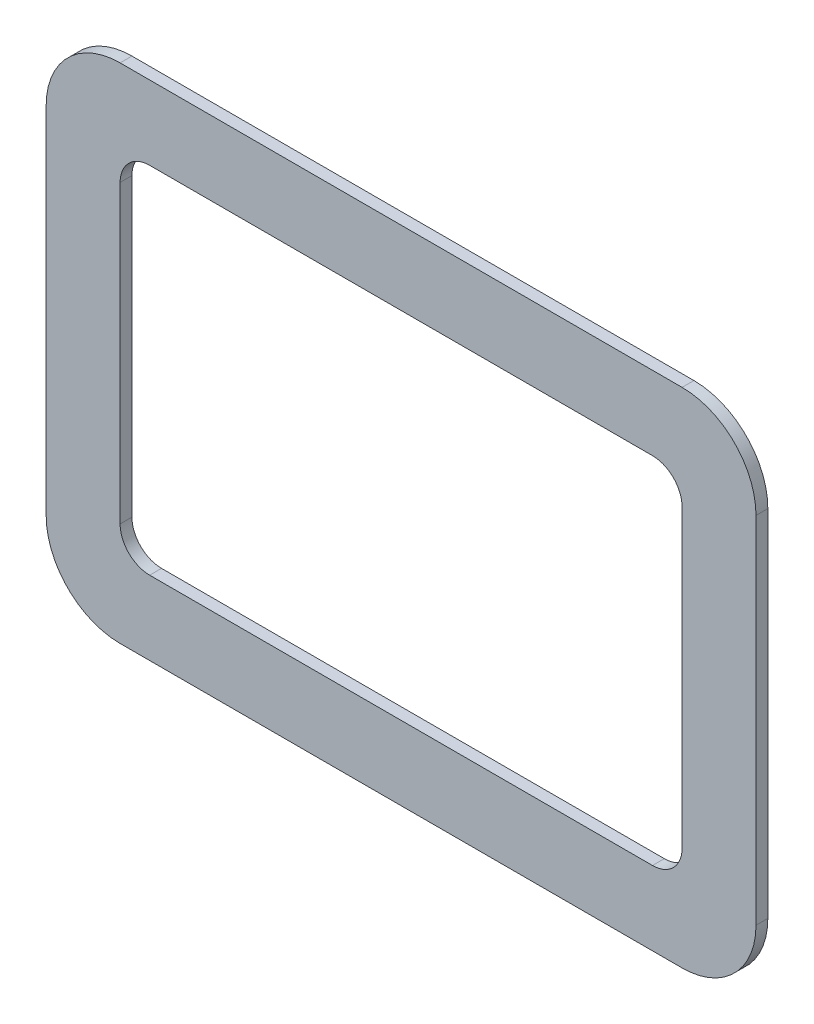
ISO-10303-21;
HEADER;
FILE_DESCRIPTION(('STEP AP214'),'2;1');
FILE_NAME('part.step','',(''),(''),'','','');
FILE_SCHEMA(('AUTOMOTIVE_DESIGN { 1 0 10303 214 1 1 1 1 }'));
ENDSEC;
DATA;
#1=APPLICATION_CONTEXT('core data for automotive mechanical design processes');
#2=APPLICATION_PROTOCOL_DEFINITION('international standard','automotive_design',2000,#1);
#3=PRODUCT_CONTEXT('',#1,'mechanical');
#4=PRODUCT('Part','Part','',(#3));
#5=PRODUCT_RELATED_PRODUCT_CATEGORY('part','',(#4));
#6=PRODUCT_DEFINITION_FORMATION('','',#4);
#7=PRODUCT_DEFINITION_CONTEXT('part definition',#1,'design');
#8=PRODUCT_DEFINITION('design','',#6,#7);
#9=PRODUCT_DEFINITION_SHAPE('','',#8);
#10=(LENGTH_UNIT() NAMED_UNIT(*) SI_UNIT(.MILLI.,.METRE.));
#11=(NAMED_UNIT(*) PLANE_ANGLE_UNIT() SI_UNIT($,.RADIAN.));
#12=(NAMED_UNIT(*) SI_UNIT($,.STERADIAN.) SOLID_ANGLE_UNIT());
#13=UNCERTAINTY_MEASURE_WITH_UNIT(LENGTH_MEASURE(1.E-05),#10,'distance_accuracy_value','');
#14=(GEOMETRIC_REPRESENTATION_CONTEXT(3) GLOBAL_UNCERTAINTY_ASSIGNED_CONTEXT((#13)) GLOBAL_UNIT_ASSIGNED_CONTEXT((#10,
#11,#12)) REPRESENTATION_CONTEXT('',''));
#15=CARTESIAN_POINT('',(0.,0.,0.));
#16=DIRECTION('',(0.,0.,1.));
#17=DIRECTION('',(1.,0.,0.));
#18=AXIS2_PLACEMENT_3D('',#15,#16,#17);
#19=CARTESIAN_POINT('',(-19.,-12.,0.8));
#20=DIRECTION('',(0.,0.,1.));
#21=DIRECTION('',(1.,0.,0.));
#22=AXIS2_PLACEMENT_3D('',#19,#20,#21);
#23=PLANE('',#22);
#24=CARTESIAN_POINT('',(-19.,-12.,0.8));
#25=DIRECTION('',(0.,0.,1.));
#26=DIRECTION('',(1.,0.,0.));
#27=AXIS2_PLACEMENT_3D('',#24,#25,#26);
#28=CIRCLE('',#27,5.);
#29=CARTESIAN_POINT('',(-24.,-12.,0.8));
#30=VERTEX_POINT('',#29);
#31=CARTESIAN_POINT('',(-19.,-17.,0.8));
#32=VERTEX_POINT('',#31);
#33=EDGE_CURVE('E214',#30,#32,#28,.T.);
#34=ORIENTED_EDGE('',*,*,#33,.T.);
#35=DIRECTION('',(1.,0.,0.));
#36=VECTOR('',#35,1.);
#37=CARTESIAN_POINT('',(-19.,-17.,0.8));
#38=LINE('',#37,#36);
#39=CARTESIAN_POINT('',(19.,-17.,0.8));
#40=VERTEX_POINT('',#39);
#41=EDGE_CURVE('E217',#32,#40,#38,.T.);
#42=ORIENTED_EDGE('',*,*,#41,.T.);
#43=CARTESIAN_POINT('',(19.,-12.,0.8));
#44=DIRECTION('',(0.,0.,1.));
#45=DIRECTION('',(1.,0.,0.));
#46=AXIS2_PLACEMENT_3D('',#43,#44,#45);
#47=CIRCLE('',#46,5.);
#48=CARTESIAN_POINT('',(24.,-12.,0.8));
#49=VERTEX_POINT('',#48);
#50=EDGE_CURVE('E220',#40,#49,#47,.T.);
#51=ORIENTED_EDGE('',*,*,#50,.T.);
#52=DIRECTION('',(0.,1.,0.));
#53=VECTOR('',#52,1.);
#54=CARTESIAN_POINT('',(24.,12.,0.8));
#55=LINE('',#54,#53);
#56=CARTESIAN_POINT('',(24.,12.,0.8));
#57=VERTEX_POINT('',#56);
#58=EDGE_CURVE('E222',#49,#57,#55,.T.);
#59=ORIENTED_EDGE('',*,*,#58,.T.);
#60=CARTESIAN_POINT('',(19.,12.,0.8));
#61=DIRECTION('',(0.,0.,1.));
#62=DIRECTION('',(-1.,0.,0.));
#63=AXIS2_PLACEMENT_3D('',#60,#61,#62);
#64=CIRCLE('',#63,5.);
#65=CARTESIAN_POINT('',(19.,17.,0.8));
#66=VERTEX_POINT('',#65);
#67=EDGE_CURVE('E224',#57,#66,#64,.T.);
#68=ORIENTED_EDGE('',*,*,#67,.T.);
#69=DIRECTION('',(-1.,0.,0.));
#70=VECTOR('',#69,1.);
#71=CARTESIAN_POINT('',(-19.,17.,0.8));
#72=LINE('',#71,#70);
#73=CARTESIAN_POINT('',(-19.,17.,0.8));
#74=VERTEX_POINT('',#73);
#75=EDGE_CURVE('E226',#66,#74,#72,.T.);
#76=ORIENTED_EDGE('',*,*,#75,.T.);
#77=CARTESIAN_POINT('',(-19.,12.,0.8));
#78=DIRECTION('',(0.,0.,1.));
#79=DIRECTION('',(1.,0.,0.));
#80=AXIS2_PLACEMENT_3D('',#77,#78,#79);
#81=CIRCLE('',#80,5.);
#82=CARTESIAN_POINT('',(-24.,12.,0.8));
#83=VERTEX_POINT('',#82);
#84=EDGE_CURVE('E228',#74,#83,#81,.T.);
#85=ORIENTED_EDGE('',*,*,#84,.T.);
#86=DIRECTION('',(0.,-1.,0.));
#87=VECTOR('',#86,1.);
#88=CARTESIAN_POINT('',(-24.,12.,0.8));
#89=LINE('',#88,#87);
#90=EDGE_CURVE('E230',#83,#30,#89,.T.);
#91=ORIENTED_EDGE('',*,*,#90,.T.);
#92=EDGE_LOOP('',(#34,#42,#51,#59,#68,#76,#85,#91));
#93=FACE_BOUND('',#92,.T.);
#94=DIRECTION('',(0.,-1.,0.));
#95=VECTOR('',#94,1.);
#96=CARTESIAN_POINT('',(-19.,9.99999999999999,0.8));
#97=LINE('',#96,#95);
#98=CARTESIAN_POINT('',(-19.,9.99999999999999,0.8));
#99=VERTEX_POINT('',#98);
#100=CARTESIAN_POINT('',(-19.,-10.,0.8));
#101=VERTEX_POINT('',#100);
#102=EDGE_CURVE('E157',#99,#101,#97,.T.);
#103=ORIENTED_EDGE('',*,*,#102,.F.);
#104=CARTESIAN_POINT('',(-17.,9.99999999999999,0.8));
#105=DIRECTION('',(0.,0.,1.));
#106=DIRECTION('',(1.,0.,0.));
#107=AXIS2_PLACEMENT_3D('',#104,#105,#106);
#108=CIRCLE('',#107,2.);
#109=CARTESIAN_POINT('',(-17.,12.,0.8));
#110=VERTEX_POINT('',#109);
#111=EDGE_CURVE('E149',#110,#99,#108,.T.);
#112=ORIENTED_EDGE('',*,*,#111,.F.);
#113=DIRECTION('',(-1.,0.,0.));
#114=VECTOR('',#113,1.);
#115=CARTESIAN_POINT('',(-17.,12.,0.8));
#116=LINE('',#115,#114);
#117=CARTESIAN_POINT('',(17.,12.,0.8));
#118=VERTEX_POINT('',#117);
#119=EDGE_CURVE('E182',#118,#110,#116,.T.);
#120=ORIENTED_EDGE('',*,*,#119,.F.);
#121=CARTESIAN_POINT('',(17.,9.99999999999999,0.8));
#122=DIRECTION('',(0.,0.,1.));
#123=DIRECTION('',(-1.,0.,0.));
#124=AXIS2_PLACEMENT_3D('',#121,#122,#123);
#125=CIRCLE('',#124,2.);
#126=CARTESIAN_POINT('',(19.,9.99999999999999,0.8));
#127=VERTEX_POINT('',#126);
#128=EDGE_CURVE('E180',#127,#118,#125,.T.);
#129=ORIENTED_EDGE('',*,*,#128,.F.);
#130=DIRECTION('',(0.,1.,0.));
#131=VECTOR('',#130,1.);
#132=CARTESIAN_POINT('',(19.,9.99999999999999,0.8));
#133=LINE('',#132,#131);
#134=CARTESIAN_POINT('',(19.,-10.,0.8));
#135=VERTEX_POINT('',#134);
#136=EDGE_CURVE('E178',#135,#127,#133,.T.);
#137=ORIENTED_EDGE('',*,*,#136,.F.);
#138=CARTESIAN_POINT('',(17.,-10.,0.8));
#139=DIRECTION('',(0.,0.,1.));
#140=DIRECTION('',(1.,0.,0.));
#141=AXIS2_PLACEMENT_3D('',#138,#139,#140);
#142=CIRCLE('',#141,2.);
#143=CARTESIAN_POINT('',(17.,-12.,0.8));
#144=VERTEX_POINT('',#143);
#145=EDGE_CURVE('E176',#144,#135,#142,.T.);
#146=ORIENTED_EDGE('',*,*,#145,.F.);
#147=DIRECTION('',(1.,0.,0.));
#148=VECTOR('',#147,1.);
#149=CARTESIAN_POINT('',(-17.,-12.,0.8));
#150=LINE('',#149,#148);
#151=CARTESIAN_POINT('',(-17.,-12.,0.8));
#152=VERTEX_POINT('',#151);
#153=EDGE_CURVE('E172',#152,#144,#150,.T.);
#154=ORIENTED_EDGE('',*,*,#153,.F.);
#155=CARTESIAN_POINT('',(-17.,-10.,0.8));
#156=DIRECTION('',(0.,0.,1.));
#157=DIRECTION('',(1.,0.,0.));
#158=AXIS2_PLACEMENT_3D('',#155,#156,#157);
#159=CIRCLE('',#158,2.);
#160=EDGE_CURVE('E170',#101,#152,#159,.T.);
#161=ORIENTED_EDGE('',*,*,#160,.F.);
#162=EDGE_LOOP('',(#103,#112,#120,#129,#137,#146,#154,#161));
#163=FACE_BOUND('',#162,.T.);
#164=ADVANCED_FACE('F36',(#93,#163),#23,.T.);
#165=CARTESIAN_POINT('',(-19.,-12.,0.));
#166=DIRECTION('',(0.,0.,1.));
#167=DIRECTION('',(1.,0.,0.));
#168=AXIS2_PLACEMENT_3D('',#165,#166,#167);
#169=PLANE('',#168);
#170=CARTESIAN_POINT('',(-19.,-12.,0.));
#171=DIRECTION('',(0.,0.,1.));
#172=DIRECTION('',(1.,0.,0.));
#173=AXIS2_PLACEMENT_3D('',#170,#171,#172);
#174=CIRCLE('',#173,5.);
#175=CARTESIAN_POINT('',(-24.,-12.,0.));
#176=VERTEX_POINT('',#175);
#177=CARTESIAN_POINT('',(-19.,-17.,0.));
#178=VERTEX_POINT('',#177);
#179=EDGE_CURVE('E165',#176,#178,#174,.T.);
#180=ORIENTED_EDGE('',*,*,#179,.F.);
#181=DIRECTION('',(0.,-1.,0.));
#182=VECTOR('',#181,1.);
#183=CARTESIAN_POINT('',(-24.,12.,0.));
#184=LINE('',#183,#182);
#185=CARTESIAN_POINT('',(-24.,12.,0.));
#186=VERTEX_POINT('',#185);
#187=EDGE_CURVE('E218',#186,#176,#184,.T.);
#188=ORIENTED_EDGE('',*,*,#187,.F.);
#189=CARTESIAN_POINT('',(-19.,12.,0.));
#190=DIRECTION('',(0.,0.,1.));
#191=DIRECTION('',(1.,0.,0.));
#192=AXIS2_PLACEMENT_3D('',#189,#190,#191);
#193=CIRCLE('',#192,5.);
#194=CARTESIAN_POINT('',(-19.,17.,0.));
#195=VERTEX_POINT('',#194);
#196=EDGE_CURVE('E245',#195,#186,#193,.T.);
#197=ORIENTED_EDGE('',*,*,#196,.F.);
#198=DIRECTION('',(-1.,0.,0.));
#199=VECTOR('',#198,1.);
#200=CARTESIAN_POINT('',(-19.,17.,0.));
#201=LINE('',#200,#199);
#202=CARTESIAN_POINT('',(19.,17.,0.));
#203=VERTEX_POINT('',#202);
#204=EDGE_CURVE('E243',#203,#195,#201,.T.);
#205=ORIENTED_EDGE('',*,*,#204,.F.);
#206=CARTESIAN_POINT('',(19.,12.,0.));
#207=DIRECTION('',(0.,0.,1.));
#208=DIRECTION('',(-1.,0.,0.));
#209=AXIS2_PLACEMENT_3D('',#206,#207,#208);
#210=CIRCLE('',#209,5.);
#211=CARTESIAN_POINT('',(24.,12.,0.));
#212=VERTEX_POINT('',#211);
#213=EDGE_CURVE('E241',#212,#203,#210,.T.);
#214=ORIENTED_EDGE('',*,*,#213,.F.);
#215=DIRECTION('',(0.,1.,0.));
#216=VECTOR('',#215,1.);
#217=CARTESIAN_POINT('',(24.,12.,0.));
#218=LINE('',#217,#216);
#219=CARTESIAN_POINT('',(24.,-12.,0.));
#220=VERTEX_POINT('',#219);
#221=EDGE_CURVE('E239',#220,#212,#218,.T.);
#222=ORIENTED_EDGE('',*,*,#221,.F.);
#223=CARTESIAN_POINT('',(19.,-12.,0.));
#224=DIRECTION('',(0.,0.,1.));
#225=DIRECTION('',(1.,0.,0.));
#226=AXIS2_PLACEMENT_3D('',#223,#224,#225);
#227=CIRCLE('',#226,5.);
#228=CARTESIAN_POINT('',(19.,-17.,0.));
#229=VERTEX_POINT('',#228);
#230=EDGE_CURVE('E237',#229,#220,#227,.T.);
#231=ORIENTED_EDGE('',*,*,#230,.F.);
#232=DIRECTION('',(1.,0.,0.));
#233=VECTOR('',#232,1.);
#234=CARTESIAN_POINT('',(-19.,-17.,0.));
#235=LINE('',#234,#233);
#236=EDGE_CURVE('E235',#178,#229,#235,.T.);
#237=ORIENTED_EDGE('',*,*,#236,.F.);
#238=EDGE_LOOP('',(#180,#188,#197,#205,#214,#222,#231,#237));
#239=FACE_BOUND('',#238,.T.);
#240=CARTESIAN_POINT('',(-17.,9.99999999999999,0.));
#241=DIRECTION('',(0.,0.,1.));
#242=DIRECTION('',(1.,0.,0.));
#243=AXIS2_PLACEMENT_3D('',#240,#241,#242);
#244=CIRCLE('',#243,2.);
#245=CARTESIAN_POINT('',(-17.,12.,0.));
#246=VERTEX_POINT('',#245);
#247=CARTESIAN_POINT('',(-19.,9.99999999999999,0.));
#248=VERTEX_POINT('',#247);
#249=EDGE_CURVE('E59',#246,#248,#244,.T.);
#250=ORIENTED_EDGE('',*,*,#249,.T.);
#251=DIRECTION('',(0.,-1.,0.));
#252=VECTOR('',#251,1.);
#253=CARTESIAN_POINT('',(-19.,9.99999999999999,0.));
#254=LINE('',#253,#252);
#255=CARTESIAN_POINT('',(-19.,-10.,0.));
#256=VERTEX_POINT('',#255);
#257=EDGE_CURVE('E164',#248,#256,#254,.T.);
#258=ORIENTED_EDGE('',*,*,#257,.T.);
#259=CARTESIAN_POINT('',(-17.,-10.,0.));
#260=DIRECTION('',(0.,0.,1.));
#261=DIRECTION('',(1.,0.,0.));
#262=AXIS2_PLACEMENT_3D('',#259,#260,#261);
#263=CIRCLE('',#262,2.);
#264=CARTESIAN_POINT('',(-17.,-12.,0.));
#265=VERTEX_POINT('',#264);
#266=EDGE_CURVE('E186',#256,#265,#263,.T.);
#267=ORIENTED_EDGE('',*,*,#266,.T.);
#268=DIRECTION('',(1.,0.,0.));
#269=VECTOR('',#268,1.);
#270=CARTESIAN_POINT('',(-17.,-12.,0.));
#271=LINE('',#270,#269);
#272=CARTESIAN_POINT('',(17.,-12.,0.));
#273=VERTEX_POINT('',#272);
#274=EDGE_CURVE('E189',#265,#273,#271,.T.);
#275=ORIENTED_EDGE('',*,*,#274,.T.);
#276=CARTESIAN_POINT('',(17.,-10.,0.));
#277=DIRECTION('',(0.,0.,1.));
#278=DIRECTION('',(1.,0.,0.));
#279=AXIS2_PLACEMENT_3D('',#276,#277,#278);
#280=CIRCLE('',#279,2.);
#281=CARTESIAN_POINT('',(19.,-10.,0.));
#282=VERTEX_POINT('',#281);
#283=EDGE_CURVE('E192',#273,#282,#280,.T.);
#284=ORIENTED_EDGE('',*,*,#283,.T.);
#285=DIRECTION('',(0.,1.,0.));
#286=VECTOR('',#285,1.);
#287=CARTESIAN_POINT('',(19.,9.99999999999999,0.));
#288=LINE('',#287,#286);
#289=CARTESIAN_POINT('',(19.,9.99999999999999,0.));
#290=VERTEX_POINT('',#289);
#291=EDGE_CURVE('E195',#282,#290,#288,.T.);
#292=ORIENTED_EDGE('',*,*,#291,.T.);
#293=CARTESIAN_POINT('',(17.,9.99999999999999,0.));
#294=DIRECTION('',(0.,0.,1.));
#295=DIRECTION('',(-1.,0.,0.));
#296=AXIS2_PLACEMENT_3D('',#293,#294,#295);
#297=CIRCLE('',#296,2.);
#298=CARTESIAN_POINT('',(17.,12.,0.));
#299=VERTEX_POINT('',#298);
#300=EDGE_CURVE('E198',#290,#299,#297,.T.);
#301=ORIENTED_EDGE('',*,*,#300,.T.);
#302=DIRECTION('',(-1.,0.,0.));
#303=VECTOR('',#302,1.);
#304=CARTESIAN_POINT('',(-17.,12.,0.));
#305=LINE('',#304,#303);
#306=EDGE_CURVE('E158',#299,#246,#305,.T.);
#307=ORIENTED_EDGE('',*,*,#306,.T.);
#308=EDGE_LOOP('',(#250,#258,#267,#275,#284,#292,#301,#307));
#309=FACE_BOUND('',#308,.T.);
#310=ADVANCED_FACE('F275',(#239,#309),#169,.F.);
#311=CARTESIAN_POINT('',(-19.,-12.,0.8));
#312=DIRECTION('',(0.,0.,-1.));
#313=DIRECTION('',(-1.,0.,0.));
#314=AXIS2_PLACEMENT_3D('',#311,#312,#313);
#315=CYLINDRICAL_SURFACE('',#314,5.);
#316=ORIENTED_EDGE('',*,*,#179,.T.);
#317=DIRECTION('',(0.,0.,-1.));
#318=VECTOR('',#317,1.);
#319=CARTESIAN_POINT('',(-19.,-17.,0.8));
#320=LINE('',#319,#318);
#321=EDGE_CURVE('E11',#32,#178,#320,.T.);
#322=ORIENTED_EDGE('',*,*,#321,.F.);
#323=ORIENTED_EDGE('',*,*,#33,.F.);
#324=DIRECTION('',(0.,0.,-1.));
#325=VECTOR('',#324,1.);
#326=CARTESIAN_POINT('',(-24.,-12.,0.8));
#327=LINE('',#326,#325);
#328=EDGE_CURVE('E232',#30,#176,#327,.T.);
#329=ORIENTED_EDGE('',*,*,#328,.T.);
#330=EDGE_LOOP('',(#316,#322,#323,#329));
#331=FACE_BOUND('',#330,.T.);
#332=ADVANCED_FACE('F38',(#331),#315,.T.);
#333=CARTESIAN_POINT('',(-19.,-17.,0.8));
#334=DIRECTION('',(0.,1.,0.));
#335=DIRECTION('',(0.,0.,1.));
#336=AXIS2_PLACEMENT_3D('',#333,#334,#335);
#337=PLANE('',#336);
#338=ORIENTED_EDGE('',*,*,#236,.T.);
#339=DIRECTION('',(0.,0.,-1.));
#340=VECTOR('',#339,1.);
#341=CARTESIAN_POINT('',(19.,-17.,0.8));
#342=LINE('',#341,#340);
#343=EDGE_CURVE('E44',#40,#229,#342,.T.);
#344=ORIENTED_EDGE('',*,*,#343,.F.);
#345=ORIENTED_EDGE('',*,*,#41,.F.);
#346=ORIENTED_EDGE('',*,*,#321,.T.);
#347=EDGE_LOOP('',(#338,#344,#345,#346));
#348=FACE_BOUND('',#347,.T.);
#349=ADVANCED_FACE('F292',(#348),#337,.F.);
#350=CARTESIAN_POINT('',(19.,-12.,0.8));
#351=DIRECTION('',(0.,0.,-1.));
#352=DIRECTION('',(-1.,0.,0.));
#353=AXIS2_PLACEMENT_3D('',#350,#351,#352);
#354=CYLINDRICAL_SURFACE('',#353,5.);
#355=ORIENTED_EDGE('',*,*,#230,.T.);
#356=DIRECTION('',(0.,0.,-1.));
#357=VECTOR('',#356,1.);
#358=CARTESIAN_POINT('',(24.,-12.,0.8));
#359=LINE('',#358,#357);
#360=EDGE_CURVE('E262',#49,#220,#359,.T.);
#361=ORIENTED_EDGE('',*,*,#360,.F.);
#362=ORIENTED_EDGE('',*,*,#50,.F.);
#363=ORIENTED_EDGE('',*,*,#343,.T.);
#364=EDGE_LOOP('',(#355,#361,#362,#363));
#365=FACE_BOUND('',#364,.T.);
#366=ADVANCED_FACE('F269',(#365),#354,.T.);
#367=CARTESIAN_POINT('',(24.,12.,0.8));
#368=DIRECTION('',(-1.,0.,0.));
#369=DIRECTION('',(0.,-1.,0.));
#370=AXIS2_PLACEMENT_3D('',#367,#368,#369);
#371=PLANE('',#370);
#372=ORIENTED_EDGE('',*,*,#221,.T.);
#373=DIRECTION('',(0.,0.,-1.));
#374=VECTOR('',#373,1.);
#375=CARTESIAN_POINT('',(24.,12.,0.8));
#376=LINE('',#375,#374);
#377=EDGE_CURVE('E259',#57,#212,#376,.T.);
#378=ORIENTED_EDGE('',*,*,#377,.F.);
#379=ORIENTED_EDGE('',*,*,#58,.F.);
#380=ORIENTED_EDGE('',*,*,#360,.T.);
#381=EDGE_LOOP('',(#372,#378,#379,#380));
#382=FACE_BOUND('',#381,.T.);
#383=ADVANCED_FACE('F281',(#382),#371,.F.);
#384=CARTESIAN_POINT('',(19.,12.,0.8));
#385=DIRECTION('',(0.,0.,-1.));
#386=DIRECTION('',(-1.,0.,0.));
#387=AXIS2_PLACEMENT_3D('',#384,#385,#386);
#388=CYLINDRICAL_SURFACE('',#387,5.);
#389=ORIENTED_EDGE('',*,*,#213,.T.);
#390=DIRECTION('',(0.,0.,-1.));
#391=VECTOR('',#390,1.);
#392=CARTESIAN_POINT('',(19.,17.,0.8));
#393=LINE('',#392,#391);
#394=EDGE_CURVE('E256',#66,#203,#393,.T.);
#395=ORIENTED_EDGE('',*,*,#394,.F.);
#396=ORIENTED_EDGE('',*,*,#67,.F.);
#397=ORIENTED_EDGE('',*,*,#377,.T.);
#398=EDGE_LOOP('',(#389,#395,#396,#397));
#399=FACE_BOUND('',#398,.T.);
#400=ADVANCED_FACE('F285',(#399),#388,.T.);
#401=CARTESIAN_POINT('',(-19.,17.,0.8));
#402=DIRECTION('',(0.,-1.,0.));
#403=DIRECTION('',(0.,0.,-1.));
#404=AXIS2_PLACEMENT_3D('',#401,#402,#403);
#405=PLANE('',#404);
#406=ORIENTED_EDGE('',*,*,#204,.T.);
#407=DIRECTION('',(0.,0.,-1.));
#408=VECTOR('',#407,1.);
#409=CARTESIAN_POINT('',(-19.,17.,0.8));
#410=LINE('',#409,#408);
#411=EDGE_CURVE('E253',#74,#195,#410,.T.);
#412=ORIENTED_EDGE('',*,*,#411,.F.);
#413=ORIENTED_EDGE('',*,*,#75,.F.);
#414=ORIENTED_EDGE('',*,*,#394,.T.);
#415=EDGE_LOOP('',(#406,#412,#413,#414));
#416=FACE_BOUND('',#415,.T.);
#417=ADVANCED_FACE('F305',(#416),#405,.F.);
#418=CARTESIAN_POINT('',(-19.,12.,0.8));
#419=DIRECTION('',(0.,0.,-1.));
#420=DIRECTION('',(-1.,0.,0.));
#421=AXIS2_PLACEMENT_3D('',#418,#419,#420);
#422=CYLINDRICAL_SURFACE('',#421,5.);
#423=ORIENTED_EDGE('',*,*,#196,.T.);
#424=DIRECTION('',(0.,0.,-1.));
#425=VECTOR('',#424,1.);
#426=CARTESIAN_POINT('',(-24.,12.,0.8));
#427=LINE('',#426,#425);
#428=EDGE_CURVE('E250',#83,#186,#427,.T.);
#429=ORIENTED_EDGE('',*,*,#428,.F.);
#430=ORIENTED_EDGE('',*,*,#84,.F.);
#431=ORIENTED_EDGE('',*,*,#411,.T.);
#432=EDGE_LOOP('',(#423,#429,#430,#431));
#433=FACE_BOUND('',#432,.T.);
#434=ADVANCED_FACE('F303',(#433),#422,.T.);
#435=CARTESIAN_POINT('',(-24.,12.,0.8));
#436=DIRECTION('',(1.,0.,0.));
#437=DIRECTION('',(0.,0.,-1.));
#438=AXIS2_PLACEMENT_3D('',#435,#436,#437);
#439=PLANE('',#438);
#440=ORIENTED_EDGE('',*,*,#187,.T.);
#441=ORIENTED_EDGE('',*,*,#328,.F.);
#442=ORIENTED_EDGE('',*,*,#90,.F.);
#443=ORIENTED_EDGE('',*,*,#428,.T.);
#444=EDGE_LOOP('',(#440,#441,#442,#443));
#445=FACE_BOUND('',#444,.T.);
#446=ADVANCED_FACE('F298',(#445),#439,.F.);
#447=CARTESIAN_POINT('',(-17.,9.99999999999999,0.8));
#448=DIRECTION('',(0.,0.,-1.));
#449=DIRECTION('',(-1.,0.,0.));
#450=AXIS2_PLACEMENT_3D('',#447,#448,#449);
#451=CYLINDRICAL_SURFACE('',#450,2.);
#452=ORIENTED_EDGE('',*,*,#249,.F.);
#453=DIRECTION('',(0.,0.,-1.));
#454=VECTOR('',#453,1.);
#455=CARTESIAN_POINT('',(-17.,12.,0.8));
#456=LINE('',#455,#454);
#457=EDGE_CURVE('E153',#110,#246,#456,.T.);
#458=ORIENTED_EDGE('',*,*,#457,.F.);
#459=ORIENTED_EDGE('',*,*,#111,.T.);
#460=DIRECTION('',(0.,0.,-1.));
#461=VECTOR('',#460,1.);
#462=CARTESIAN_POINT('',(-19.,9.99999999999999,0.8));
#463=LINE('',#462,#461);
#464=EDGE_CURVE('E152',#99,#248,#463,.T.);
#465=ORIENTED_EDGE('',*,*,#464,.T.);
#466=EDGE_LOOP('',(#452,#458,#459,#465));
#467=FACE_BOUND('',#466,.T.);
#468=ADVANCED_FACE('F151',(#467),#451,.F.);
#469=CARTESIAN_POINT('',(-19.,9.99999999999999,0.8));
#470=DIRECTION('',(1.,0.,0.));
#471=DIRECTION('',(0.,0.,-1.));
#472=AXIS2_PLACEMENT_3D('',#469,#470,#471);
#473=PLANE('',#472);
#474=ORIENTED_EDGE('',*,*,#257,.F.);
#475=ORIENTED_EDGE('',*,*,#464,.F.);
#476=ORIENTED_EDGE('',*,*,#102,.T.);
#477=DIRECTION('',(0.,0.,-1.));
#478=VECTOR('',#477,1.);
#479=CARTESIAN_POINT('',(-19.,-10.,0.8));
#480=LINE('',#479,#478);
#481=EDGE_CURVE('E166',#101,#256,#480,.T.);
#482=ORIENTED_EDGE('',*,*,#481,.T.);
#483=EDGE_LOOP('',(#474,#475,#476,#482));
#484=FACE_BOUND('',#483,.T.);
#485=ADVANCED_FACE('F161',(#484),#473,.T.);
#486=CARTESIAN_POINT('',(-17.,-10.,0.8));
#487=DIRECTION('',(0.,0.,-1.));
#488=DIRECTION('',(-1.,0.,0.));
#489=AXIS2_PLACEMENT_3D('',#486,#487,#488);
#490=CYLINDRICAL_SURFACE('',#489,2.);
#491=ORIENTED_EDGE('',*,*,#266,.F.);
#492=ORIENTED_EDGE('',*,*,#481,.F.);
#493=ORIENTED_EDGE('',*,*,#160,.T.);
#494=DIRECTION('',(0.,0.,-1.));
#495=VECTOR('',#494,1.);
#496=CARTESIAN_POINT('',(-17.,-12.,0.8));
#497=LINE('',#496,#495);
#498=EDGE_CURVE('E211',#152,#265,#497,.T.);
#499=ORIENTED_EDGE('',*,*,#498,.T.);
#500=EDGE_LOOP('',(#491,#492,#493,#499));
#501=FACE_BOUND('',#500,.T.);
#502=ADVANCED_FACE('F330',(#501),#490,.F.);
#503=CARTESIAN_POINT('',(-17.,-12.,0.8));
#504=DIRECTION('',(0.,1.,0.));
#505=DIRECTION('',(0.,0.,1.));
#506=AXIS2_PLACEMENT_3D('',#503,#504,#505);
#507=PLANE('',#506);
#508=ORIENTED_EDGE('',*,*,#274,.F.);
#509=ORIENTED_EDGE('',*,*,#498,.F.);
#510=ORIENTED_EDGE('',*,*,#153,.T.);
#511=DIRECTION('',(0.,0.,-1.));
#512=VECTOR('',#511,1.);
#513=CARTESIAN_POINT('',(17.,-12.,0.8));
#514=LINE('',#513,#512);
#515=EDGE_CURVE('E209',#144,#273,#514,.T.);
#516=ORIENTED_EDGE('',*,*,#515,.T.);
#517=EDGE_LOOP('',(#508,#509,#510,#516));
#518=FACE_BOUND('',#517,.T.);
#519=ADVANCED_FACE('F334',(#518),#507,.T.);
#520=CARTESIAN_POINT('',(17.,-10.,0.8));
#521=DIRECTION('',(0.,0.,-1.));
#522=DIRECTION('',(-1.,0.,0.));
#523=AXIS2_PLACEMENT_3D('',#520,#521,#522);
#524=CYLINDRICAL_SURFACE('',#523,2.);
#525=ORIENTED_EDGE('',*,*,#283,.F.);
#526=ORIENTED_EDGE('',*,*,#515,.F.);
#527=ORIENTED_EDGE('',*,*,#145,.T.);
#528=DIRECTION('',(0.,0.,-1.));
#529=VECTOR('',#528,1.);
#530=CARTESIAN_POINT('',(19.,-10.,0.8));
#531=LINE('',#530,#529);
#532=EDGE_CURVE('E207',#135,#282,#531,.T.);
#533=ORIENTED_EDGE('',*,*,#532,.T.);
#534=EDGE_LOOP('',(#525,#526,#527,#533));
#535=FACE_BOUND('',#534,.T.);
#536=ADVANCED_FACE('F340',(#535),#524,.F.);
#537=CARTESIAN_POINT('',(19.,9.99999999999999,0.8));
#538=DIRECTION('',(-1.,0.,0.));
#539=DIRECTION('',(0.,-1.,0.));
#540=AXIS2_PLACEMENT_3D('',#537,#538,#539);
#541=PLANE('',#540);
#542=ORIENTED_EDGE('',*,*,#291,.F.);
#543=ORIENTED_EDGE('',*,*,#532,.F.);
#544=ORIENTED_EDGE('',*,*,#136,.T.);
#545=DIRECTION('',(0.,0.,-1.));
#546=VECTOR('',#545,1.);
#547=CARTESIAN_POINT('',(19.,9.99999999999999,0.8));
#548=LINE('',#547,#546);
#549=EDGE_CURVE('E205',#127,#290,#548,.T.);
#550=ORIENTED_EDGE('',*,*,#549,.T.);
#551=EDGE_LOOP('',(#542,#543,#544,#550));
#552=FACE_BOUND('',#551,.T.);
#553=ADVANCED_FACE('F344',(#552),#541,.T.);
#554=CARTESIAN_POINT('',(17.,9.99999999999999,0.8));
#555=DIRECTION('',(0.,0.,-1.));
#556=DIRECTION('',(-1.,0.,0.));
#557=AXIS2_PLACEMENT_3D('',#554,#555,#556);
#558=CYLINDRICAL_SURFACE('',#557,2.);
#559=ORIENTED_EDGE('',*,*,#300,.F.);
#560=ORIENTED_EDGE('',*,*,#549,.F.);
#561=ORIENTED_EDGE('',*,*,#128,.T.);
#562=DIRECTION('',(0.,0.,-1.));
#563=VECTOR('',#562,1.);
#564=CARTESIAN_POINT('',(17.,12.,0.8));
#565=LINE('',#564,#563);
#566=EDGE_CURVE('E51',#118,#299,#565,.T.);
#567=ORIENTED_EDGE('',*,*,#566,.T.);
#568=EDGE_LOOP('',(#559,#560,#561,#567));
#569=FACE_BOUND('',#568,.T.);
#570=ADVANCED_FACE('F348',(#569),#558,.F.);
#571=CARTESIAN_POINT('',(-17.,12.,0.8));
#572=DIRECTION('',(0.,-1.,0.));
#573=DIRECTION('',(0.,0.,-1.));
#574=AXIS2_PLACEMENT_3D('',#571,#572,#573);
#575=PLANE('',#574);
#576=ORIENTED_EDGE('',*,*,#306,.F.);
#577=ORIENTED_EDGE('',*,*,#566,.F.);
#578=ORIENTED_EDGE('',*,*,#119,.T.);
#579=ORIENTED_EDGE('',*,*,#457,.T.);
#580=EDGE_LOOP('',(#576,#577,#578,#579));
#581=FACE_BOUND('',#580,.T.);
#582=ADVANCED_FACE('F352',(#581),#575,.T.);
#583=CLOSED_SHELL('',(#164,#310,#332,#349,#366,#383,#400,#417,#434,#446,#468,#485,#502,#519,
#536,#553,#570,#582));
#584=MANIFOLD_SOLID_BREP('B2',#583);
#585=ADVANCED_BREP_SHAPE_REPRESENTATION('',(#18,#584),#14);
#586=SHAPE_DEFINITION_REPRESENTATION(#9,#585);
ENDSEC;
END-ISO-10303-21;
